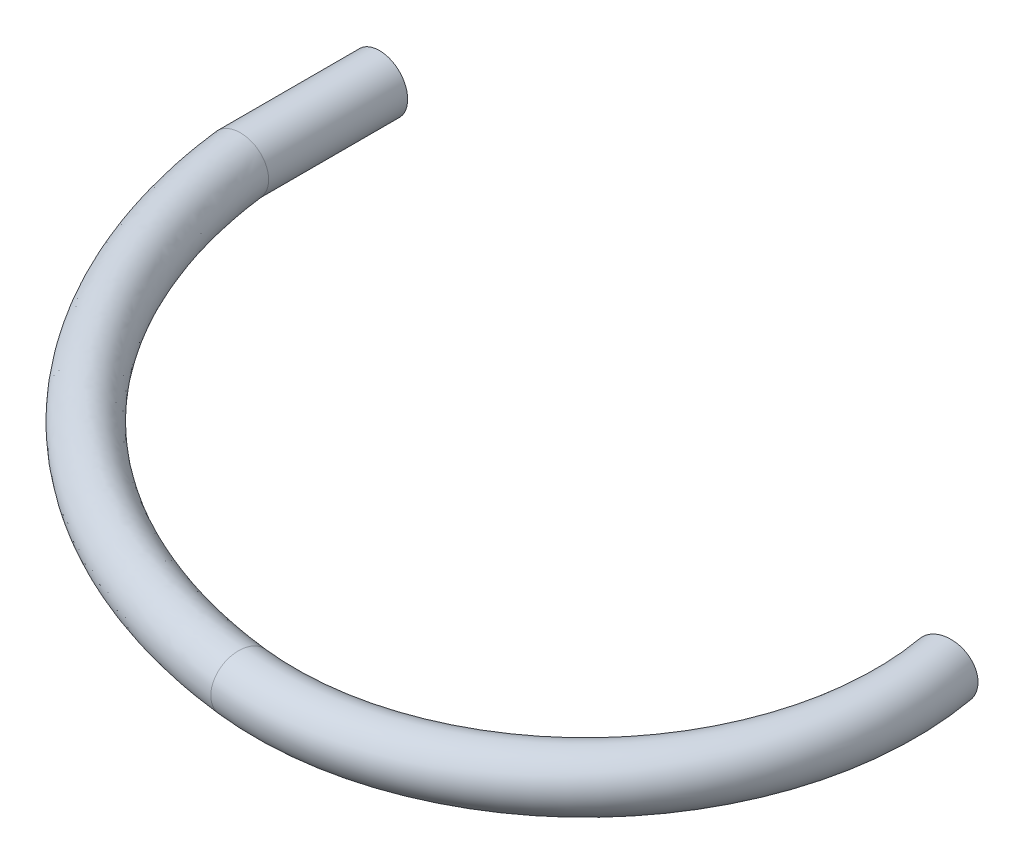
ISO-10303-21;
HEADER;
FILE_DESCRIPTION(('STEP AP214'),'2;1');
FILE_NAME('part.step','',(''),(''),'','','');
FILE_SCHEMA(('AUTOMOTIVE_DESIGN { 1 0 10303 214 1 1 1 1 }'));
ENDSEC;
DATA;
#1=APPLICATION_CONTEXT('core data for automotive mechanical design processes');
#2=APPLICATION_PROTOCOL_DEFINITION('international standard','automotive_design',2000,#1);
#3=PRODUCT_CONTEXT('',#1,'mechanical');
#4=PRODUCT('Part','Part','',(#3));
#5=PRODUCT_RELATED_PRODUCT_CATEGORY('part','',(#4));
#6=PRODUCT_DEFINITION_FORMATION('','',#4);
#7=PRODUCT_DEFINITION_CONTEXT('part definition',#1,'design');
#8=PRODUCT_DEFINITION('design','',#6,#7);
#9=PRODUCT_DEFINITION_SHAPE('','',#8);
#10=(LENGTH_UNIT() NAMED_UNIT(*) SI_UNIT(.MILLI.,.METRE.));
#11=(NAMED_UNIT(*) PLANE_ANGLE_UNIT() SI_UNIT($,.RADIAN.));
#12=(NAMED_UNIT(*) SI_UNIT($,.STERADIAN.) SOLID_ANGLE_UNIT());
#13=UNCERTAINTY_MEASURE_WITH_UNIT(LENGTH_MEASURE(1.E-05),#10,'distance_accuracy_value','');
#14=(GEOMETRIC_REPRESENTATION_CONTEXT(3) GLOBAL_UNCERTAINTY_ASSIGNED_CONTEXT((#13)) GLOBAL_UNIT_ASSIGNED_CONTEXT((#10,
#11,#12)) REPRESENTATION_CONTEXT('',''));
#15=CARTESIAN_POINT('',(0.,0.,0.));
#16=DIRECTION('',(0.,0.,1.));
#17=DIRECTION('',(1.,0.,0.));
#18=AXIS2_PLACEMENT_3D('',#15,#16,#17);
#19=CARTESIAN_POINT('',(112.254038487492,0.,31.8995068464256));
#20=DIRECTION('',(-0.17683972373716,0.,-0.984239661926182));
#21=DIRECTION('',(-0.984239661926182,0.,0.17683972373716));
#22=AXIS2_PLACEMENT_3D('',#19,#20,#21);
#23=PLANE('',#22);
#24=CARTESIAN_POINT('',(112.254038487492,0.,31.8995068464256));
#25=DIRECTION('',(-0.17683972373716,0.,-0.984239661926182));
#26=DIRECTION('',(-0.984239661926182,0.,0.17683972373716));
#27=AXIS2_PLACEMENT_3D('',#24,#25,#26);
#28=CIRCLE('',#27,4.);
#29=CARTESIAN_POINT('',(116.190997135197,0.,31.1921479514769));
#30=VERTEX_POINT('',#29);
#31=EDGE_CURVE('E46',#30,#30,#28,.T.);
#32=ORIENTED_EDGE('',*,*,#31,.T.);
#33=EDGE_LOOP('',(#32));
#34=FACE_BOUND('',#33,.T.);
#35=ADVANCED_FACE('F43',(#34),#23,.T.);
#36=CARTESIAN_POINT('',(0.,0.,0.));
#37=DIRECTION('',(0.,0.,1.));
#38=DIRECTION('',(1.,0.,0.));
#39=AXIS2_PLACEMENT_3D('',#36,#37,#38);
#40=PLANE('',#39);
#41=CARTESIAN_POINT('',(0.,0.,0.));
#42=DIRECTION('',(0.,0.,1.));
#43=DIRECTION('',(1.,0.,0.));
#44=AXIS2_PLACEMENT_3D('',#41,#42,#43);
#45=CIRCLE('',#44,4.);
#46=CARTESIAN_POINT('',(4.,0.,0.));
#47=VERTEX_POINT('',#46);
#48=EDGE_CURVE('E63',#47,#47,#45,.T.);
#49=ORIENTED_EDGE('',*,*,#48,.F.);
#50=EDGE_LOOP('',(#49));
#51=FACE_BOUND('',#50,.T.);
#52=ADVANCED_FACE('F91',(#51),#40,.F.);
#53=CARTESIAN_POINT('',(68.969627827404,0.,39.6764777604771));
#54=DIRECTION('',(0.,1.,0.));
#55=DIRECTION('',(0.,0.,1.));
#56=AXIS2_PLACEMENT_3D('',#53,#54,#55);
#57=TOROIDAL_SURFACE('',#56,43.9775111027121,4.);
#58=CARTESIAN_POINT('',(63.8332428595129,0.,83.3530050062505));
#59=DIRECTION('',(0.993155959730515,0.,0.116795717608821));
#60=DIRECTION('',(0.116795717608821,0.,-0.993155959730515));
#61=AXIS2_PLACEMENT_3D('',#58,#59,#60);
#62=CIRCLE('',#61,4.);
#63=CARTESIAN_POINT('',(63.3660599890776,0.,87.3256288451725));
#64=VERTEX_POINT('',#63);
#65=EDGE_CURVE('E139',#64,#64,#62,.T.);
#66=CARTESIAN_POINT('',(68.969627827404,0.,39.6764777604771));
#67=DIRECTION('',(0.,1.,0.));
#68=DIRECTION('',(0.,0.,1.));
#69=AXIS2_PLACEMENT_3D('',#66,#67,#68);
#70=CIRCLE('',#69,47.9775111027121);
#71=EDGE_CURVE('',#64,#30,#70,.T.);
#72=ORIENTED_EDGE('',*,*,#65,.T.);
#73=ORIENTED_EDGE('',*,*,#31,.F.);
#74=ORIENTED_EDGE('',*,*,#71,.T.);
#75=ORIENTED_EDGE('',*,*,#71,.F.);
#76=EDGE_LOOP('',(#72,#74,#73,#75));
#77=FACE_BOUND('',#76,.T.);
#78=ADVANCED_FACE('F82',(#77),#57,.T.);
#79=CARTESIAN_POINT('',(3.92243417999132,0.,19.131227352295));
#80=CARTESIAN_POINT('',(3.93795031240802,0.,19.2550951386539));
#81=CARTESIAN_POINT('',(3.95389163987146,0.,19.3823605803521));
#82=CARTESIAN_POINT('',(4.03000584490323,0.,19.9899761331784));
#83=CARTESIAN_POINT('',(4.09249880961834,0.,20.4490169712662));
#84=CARTESIAN_POINT('',(4.23073210210726,0.,21.3931264613839));
#85=CARTESIAN_POINT('',(4.30474982846883,0.,21.8644564047419));
#86=CARTESIAN_POINT('',(4.54145878444363,0.,23.2759762977133));
#87=CARTESIAN_POINT('',(4.71880793578901,0.,24.2136967502557));
#88=CARTESIAN_POINT('',(5.30903013894282,0.,27.0145924952574));
#89=CARTESIAN_POINT('',(5.78011295662286,0.,28.8654977322318));
#90=CARTESIAN_POINT('',(7.42127892883128,0.,34.3499680743171));
#91=CARTESIAN_POINT('',(8.81969509014636,0.,37.914884529046));
#92=CARTESIAN_POINT('',(13.870788547002,0.,48.1899672913297));
#93=CARTESIAN_POINT('',(18.385926823418,0.,54.4740887549169));
#94=CARTESIAN_POINT('',(29.2212935906813,0.,65.2279376008308));
#95=CARTESIAN_POINT('',(35.539332458638,0.,69.6954918395956));
#96=CARTESIAN_POINT('',(49.2899107638137,0.,76.3266330867662));
#97=CARTESIAN_POINT('',(56.7196713982393,0.,78.4888800556315));
#98=CARTESIAN_POINT('',(64.3004257299481,0.,79.3803811673284));
#99=CARTESIAN_POINT('',(3.92243417999132,8.,19.131227352295));
#100=CARTESIAN_POINT('',(3.93795031240802,8.,19.2550951386539));
#101=CARTESIAN_POINT('',(3.95389163987146,8.,19.3823605803521));
#102=CARTESIAN_POINT('',(4.03000584490323,8.,19.9899761331784));
#103=CARTESIAN_POINT('',(4.09249880961834,8.,20.4490169712662));
#104=CARTESIAN_POINT('',(4.23073210210726,8.,21.3931264613839));
#105=CARTESIAN_POINT('',(4.30474982846883,8.,21.8644564047419));
#106=CARTESIAN_POINT('',(4.54145878444363,8.,23.2759762977133));
#107=CARTESIAN_POINT('',(4.71880793578901,8.,24.2136967502557));
#108=CARTESIAN_POINT('',(5.30903013894282,8.,27.0145924952574));
#109=CARTESIAN_POINT('',(5.78011295662286,8.,28.8654977322318));
#110=CARTESIAN_POINT('',(7.42127892883128,8.,34.3499680743171));
#111=CARTESIAN_POINT('',(8.81969509014636,8.,37.914884529046));
#112=CARTESIAN_POINT('',(13.870788547002,8.,48.1899672913297));
#113=CARTESIAN_POINT('',(18.385926823418,8.,54.4740887549169));
#114=CARTESIAN_POINT('',(29.2212935906813,8.,65.2279376008308));
#115=CARTESIAN_POINT('',(35.539332458638,8.,69.6954918395956));
#116=CARTESIAN_POINT('',(49.2899107638137,8.,76.3266330867662));
#117=CARTESIAN_POINT('',(56.7196713982393,8.,78.4888800556315));
#118=CARTESIAN_POINT('',(64.3004257299481,8.,79.3803811673284));
#119=CARTESIAN_POINT('',(-4.01553097449153,8.,20.1255659295492));
#120=CARTESIAN_POINT('',(-4.00001484207484,8.,20.2494337159081));
#121=CARTESIAN_POINT('',(-3.98492475385736,8.,20.3699039553106));
#122=CARTESIAN_POINT('',(-3.90451715094644,8.,21.011792489867));
#123=CARTESIAN_POINT('',(-3.83112791423149,8.,21.5531939543116));
#124=CARTESIAN_POINT('',(-3.67684775537159,8.,22.6069007675798));
#125=CARTESIAN_POINT('',(-3.59423765200311,8.,23.132945233621));
#126=CARTESIAN_POINT('',(-3.3300502433574,8.,24.7083219710215));
#127=CARTESIAN_POINT('',(-3.13211344571064,8.,25.7548980727607));
#128=CARTESIAN_POINT('',(-2.47337506492864,8.,28.8809369068796));
#129=CARTESIAN_POINT('',(-1.94760641224395,8.,30.9467052095151));
#130=CARTESIAN_POINT('',(-0.115925039772885,8.,37.0678424580481));
#131=CARTESIAN_POINT('',(1.44482681409656,8.,41.0465936478206));
#132=CARTESIAN_POINT('',(7.08227845045061,8.,52.5144634518985));
#133=CARTESIAN_POINT('',(12.1215583374653,8.,59.5280796382962));
#134=CARTESIAN_POINT('',(24.2147529366709,8.,71.530293276037));
#135=CARTESIAN_POINT('',(31.2662238426417,8.,76.5164653136402));
#136=CARTESIAN_POINT('',(46.6130434629126,8.,83.917385212196));
#137=CARTESIAN_POINT('',(54.9052907958328,8.,86.3306374747177));
#138=CARTESIAN_POINT('',(63.3660599890775,8.,87.3256288451725));
#139=CARTESIAN_POINT('',(-4.01553097449154,0.,20.1255659295492));
#140=CARTESIAN_POINT('',(-4.00001484207484,0.,20.2494337159081));
#141=CARTESIAN_POINT('',(-3.98492475385739,0.,20.3699039553106));
#142=CARTESIAN_POINT('',(-3.90451715094633,0.,21.011792489867));
#143=CARTESIAN_POINT('',(-3.83112791423149,0.,21.5531939543116));
#144=CARTESIAN_POINT('',(-3.6768477553716,0.,22.6069007675798));
#145=CARTESIAN_POINT('',(-3.59423765200311,0.,23.132945233621));
#146=CARTESIAN_POINT('',(-3.3300502433574,0.,24.7083219710215));
#147=CARTESIAN_POINT('',(-3.13211344571064,0.,25.7548980727616));
#148=CARTESIAN_POINT('',(-2.47337506492864,0.,28.8809369068779));
#149=CARTESIAN_POINT('',(-1.94760641224395,0.,30.9467052095186));
#150=CARTESIAN_POINT('',(-0.115925039772886,0.,37.0678424580411));
#151=CARTESIAN_POINT('',(1.44482681409655,0.,41.0465936478206));
#152=CARTESIAN_POINT('',(7.08227845045061,0.,52.5144634518985));
#153=CARTESIAN_POINT('',(12.1215583374653,0.,59.5280796382962));
#154=CARTESIAN_POINT('',(24.2147529366709,0.,71.530293276037));
#155=CARTESIAN_POINT('',(31.2662238426417,0.,76.5164653136402));
#156=CARTESIAN_POINT('',(46.6130434629126,0.,83.917385212196));
#157=CARTESIAN_POINT('',(54.9052907958328,0.,86.3306374747177));
#158=CARTESIAN_POINT('',(63.3660599890775,0.,87.3256288451725));
#159=CARTESIAN_POINT('',(-4.01553097449154,-8.,20.1255659295492));
#160=CARTESIAN_POINT('',(-4.00001484207484,-8.,20.2494337159081));
#161=CARTESIAN_POINT('',(-3.98492475385742,-8.,20.3699039553106));
#162=CARTESIAN_POINT('',(-3.90451715094623,-8.,21.011792489867));
#163=CARTESIAN_POINT('',(-3.83112791423149,-8.,21.5531939543116));
#164=CARTESIAN_POINT('',(-3.6768477553716,-8.,22.6069007675798));
#165=CARTESIAN_POINT('',(-3.59423765200311,-8.,23.132945233621));
#166=CARTESIAN_POINT('',(-3.33005024335741,-8.,24.7083219710215));
#167=CARTESIAN_POINT('',(-3.13211344571064,-8.,25.7548980727625));
#168=CARTESIAN_POINT('',(-2.47337506492864,-8.,28.8809369068761));
#169=CARTESIAN_POINT('',(-1.94760641224395,-8.,30.9467052095221));
#170=CARTESIAN_POINT('',(-0.115925039772887,-8.,37.0678424580341));
#171=CARTESIAN_POINT('',(1.44482681409655,-8.,41.0465936478206));
#172=CARTESIAN_POINT('',(7.08227845045061,-8.,52.5144634518985));
#173=CARTESIAN_POINT('',(12.1215583374653,-8.,59.5280796382962));
#174=CARTESIAN_POINT('',(24.2147529366709,-8.,71.530293276037));
#175=CARTESIAN_POINT('',(31.2662238426417,-8.,76.5164653136402));
#176=CARTESIAN_POINT('',(46.6130434629126,-8.,83.917385212196));
#177=CARTESIAN_POINT('',(54.9052907958328,-8.,86.3306374747177));
#178=CARTESIAN_POINT('',(63.3660599890775,-8.,87.3256288451725));
#179=CARTESIAN_POINT('',(3.92243417999132,-8.,19.131227352295));
#180=CARTESIAN_POINT('',(3.93795031240802,-8.,19.2550951386539));
#181=CARTESIAN_POINT('',(3.95389163987146,-8.,19.3823605803521));
#182=CARTESIAN_POINT('',(4.03000584490323,-8.,19.9899761331784));
#183=CARTESIAN_POINT('',(4.09249880961834,-8.,20.4490169712662));
#184=CARTESIAN_POINT('',(4.23073210210726,-8.,21.3931264613839));
#185=CARTESIAN_POINT('',(4.30474982846883,-8.,21.8644564047419));
#186=CARTESIAN_POINT('',(4.54145878444363,-8.,23.2759762977133));
#187=CARTESIAN_POINT('',(4.71880793578901,-8.,24.2136967502557));
#188=CARTESIAN_POINT('',(5.30903013894282,-8.,27.0145924952574));
#189=CARTESIAN_POINT('',(5.78011295662286,-8.,28.8654977322318));
#190=CARTESIAN_POINT('',(7.42127892883128,-8.,34.3499680743171));
#191=CARTESIAN_POINT('',(8.81969509014636,-8.,37.914884529046));
#192=CARTESIAN_POINT('',(13.870788547002,-8.,48.1899672913297));
#193=CARTESIAN_POINT('',(18.385926823418,-8.,54.4740887549169));
#194=CARTESIAN_POINT('',(29.2212935906813,-8.,65.2279376008308));
#195=CARTESIAN_POINT('',(35.539332458638,-8.,69.6954918395956));
#196=CARTESIAN_POINT('',(49.2899107638137,-8.,76.3266330867662));
#197=CARTESIAN_POINT('',(56.7196713982393,-8.,78.4888800556315));
#198=CARTESIAN_POINT('',(64.3004257299481,-8.,79.3803811673284));
#199=CARTESIAN_POINT('',(3.92243417999132,0.,19.131227352295));
#200=CARTESIAN_POINT('',(3.93795031240802,0.,19.2550951386539));
#201=CARTESIAN_POINT('',(3.95389163987146,0.,19.3823605803521));
#202=CARTESIAN_POINT('',(4.03000584490323,0.,19.9899761331784));
#203=CARTESIAN_POINT('',(4.09249880961834,0.,20.4490169712662));
#204=CARTESIAN_POINT('',(4.23073210210726,0.,21.3931264613839));
#205=CARTESIAN_POINT('',(4.30474982846883,0.,21.8644564047419));
#206=CARTESIAN_POINT('',(4.54145878444363,0.,23.2759762977133));
#207=CARTESIAN_POINT('',(4.71880793578901,0.,24.2136967502557));
#208=CARTESIAN_POINT('',(5.30903013894282,0.,27.0145924952574));
#209=CARTESIAN_POINT('',(5.78011295662286,0.,28.8654977322318));
#210=CARTESIAN_POINT('',(7.42127892883128,0.,34.3499680743171));
#211=CARTESIAN_POINT('',(8.81969509014636,0.,37.914884529046));
#212=CARTESIAN_POINT('',(13.870788547002,0.,48.1899672913297));
#213=CARTESIAN_POINT('',(18.385926823418,0.,54.4740887549169));
#214=CARTESIAN_POINT('',(29.2212935906813,0.,65.2279376008308));
#215=CARTESIAN_POINT('',(35.539332458638,0.,69.6954918395956));
#216=CARTESIAN_POINT('',(49.2899107638137,0.,76.3266330867662));
#217=CARTESIAN_POINT('',(56.7196713982393,0.,78.4888800556315));
#218=CARTESIAN_POINT('',(64.3004257299481,0.,79.3803811673284));
#219=(BOUNDED_SURFACE() B_SPLINE_SURFACE(3,3,((#79,#80,#81,#82,#83,#84,#85,#86,#87,#88,#89,#90,
#91,#92,#93,#94,#95,#96,#97,#98),(#99,#100,#101,#102,#103,#104,#105,#106,#107,#108,#109,#110,
#111,#112,#113,#114,#115,#116,#117,#118),(#119,#120,#121,#122,#123,#124,#125,#126,#127,#128,
#129,#130,#131,#132,#133,#134,#135,#136,#137,#138),(#139,#140,#141,#142,#143,#144,#145,#146,
#147,#148,#149,#150,#151,#152,#153,#154,#155,#156,#157,#158),(#159,#160,#161,#162,#163,#164,
#165,#166,#167,#168,#169,#170,#171,#172,#173,#174,#175,#176,#177,#178),(#179,#180,#181,#182,
#183,#184,#185,#186,#187,#188,#189,#190,#191,#192,#193,#194,#195,#196,#197,#198),(#199,#200,
#201,#202,#203,#204,#205,#206,#207,#208,#209,#210,#211,#212,#213,#214,#215,#216,#217,#218)),
.UNSPECIFIED.,.T.,.F.,.F.) B_SPLINE_SURFACE_WITH_KNOTS((4,3,4),(4,2,2,2,2,2,2,2,2,4),(0.,0.5,
1.),(-0.0020925133234745,0.,0.00846150225753349,0.016923004515067,0.033846009030134,
0.0676920180602679,0.135384036120536,0.270768072241072,0.406152108361608,0.541536144482143),
.UNSPECIFIED.) GEOMETRIC_REPRESENTATION_ITEM() RATIONAL_B_SPLINE_SURFACE(((1.,1.,1.,1.,1.,1.,1.,
1.,1.,1.,1.,1.,1.,1.,1.,1.,1.,1.,1.,1.),(0.333333333333333,0.333333333333333,0.333333333333333,
0.333333333333333,0.333333333333333,0.333333333333333,0.333333333333333,0.333333333333333,
0.333333333333333,0.333333333333333,0.333333333333333,0.333333333333333,0.333333333333333,
0.333333333333333,0.333333333333333,0.333333333333333,0.333333333333333,0.333333333333333,
0.333333333333333,0.333333333333333),(0.333333333333333,0.333333333333333,0.333333333333333,
0.333333333333333,0.333333333333333,0.333333333333333,0.333333333333333,0.333333333333333,
0.333333333333333,0.333333333333333,0.333333333333333,0.333333333333333,0.333333333333333,
0.333333333333333,0.333333333333333,0.333333333333333,0.333333333333333,0.333333333333333,
0.333333333333333,0.333333333333333),(1.,1.,1.,1.,1.,1.,1.,1.,1.,1.,1.,1.,1.,1.,1.,1.,1.,1.,1.,
1.),(0.333333333333333,0.333333333333333,0.333333333333333,0.333333333333333,0.333333333333333,
0.333333333333333,0.333333333333333,0.333333333333333,0.333333333333333,0.333333333333333,
0.333333333333333,0.333333333333333,0.333333333333333,0.333333333333333,0.333333333333333,
0.333333333333333,0.333333333333333,0.333333333333333,0.333333333333333,0.333333333333333),
(0.333333333333333,0.333333333333333,0.333333333333333,0.333333333333333,0.333333333333333,
0.333333333333333,0.333333333333333,0.333333333333333,0.333333333333333,0.333333333333333,
0.333333333333333,0.333333333333333,0.333333333333333,0.333333333333333,0.333333333333333,
0.333333333333333,0.333333333333333,0.333333333333333,0.333333333333333,0.333333333333333),(1.,
1.,1.,1.,1.,1.,1.,1.,1.,1.,1.,1.,1.,1.,1.,1.,1.,1.,1.,1.))) REPRESENTATION_ITEM('') SURFACE());
#220=CARTESIAN_POINT('',(0.,-4.,20.));
#221=CARTESIAN_POINT('',(-0.011935794807484,-4.00000007340912,20.0007446715165));
#222=CARTESIAN_POINT('',(-0.0238722044714065,-3.99994663671084,20.0014893811523));
#223=CARTESIAN_POINT('',(-0.148208547472157,-3.99883287685429,20.0092466922408));
#224=CARTESIAN_POINT('',(-0.260614138843314,-3.99308341390221,20.0162596257737));
#225=CARTESIAN_POINT('',(-0.48457385095584,-3.97213440302133,20.0302323320152));
#226=CARTESIAN_POINT('',(-0.596127516960446,-3.95693012266944,20.0371920763339));
#227=CARTESIAN_POINT('',(-0.817814075365346,-3.91712659504178,20.0510228903669));
#228=CARTESIAN_POINT('',(-0.927943409262226,-3.89250727690025,20.0578937379967));
#229=CARTESIAN_POINT('',(-1.1457943533043,-3.83404510603826,20.0714851887242));
#230=CARTESIAN_POINT('',(-1.25351407221183,-3.80019526565363,20.0782056738074));
#231=CARTESIAN_POINT('',(-1.57140031977759,-3.68528278818464,20.0980381220964));
#232=CARTESIAN_POINT('',(-1.77688542058312,-3.59075034864622,20.1108579802436));
#233=CARTESIAN_POINT('',(-2.16905875453527,-3.36838210927783,20.1353249277009));
#234=CARTESIAN_POINT('',(-2.35574618672501,-3.24054489118396,20.146971967038));
#235=CARTESIAN_POINT('',(-2.61751636178703,-3.02677165898112,20.163303233754));
#236=CARTESIAN_POINT('',(-2.70174450264648,-2.95182727718698,20.1685580375617));
#237=CARTESIAN_POINT('',(-2.86353235380145,-2.79514527803056,20.178651609714));
#238=CARTESIAN_POINT('',(-2.94109842587468,-2.71341429145213,20.1834907749624));
#239=CARTESIAN_POINT('',(-3.08910568648603,-2.54364176353361,20.1927245958261));
#240=CARTESIAN_POINT('',(-3.15954334367003,-2.45559713101159,20.1971190311262));
#241=CARTESIAN_POINT('',(-3.29275356322931,-2.27387055935346,20.2054296918004));
#242=CARTESIAN_POINT('',(-3.35552435541969,-2.18018732575908,20.2093458067362));
#243=CARTESIAN_POINT('',(-3.53136506720669,-1.89206178006912,20.2203160724024));
#244=CARTESIAN_POINT('',(-3.63239905370219,-1.69004280242001,20.2266193282325));
#245=CARTESIAN_POINT('',(-3.79905361000752,-1.27196855854819,20.237016484536));
#246=CARTESIAN_POINT('',(-3.86467527760204,-1.0559137276707,20.2411104534975));
#247=CARTESIAN_POINT('',(-3.95863268938738,-0.616166625222815,20.246972217339));
#248=CARTESIAN_POINT('',(-3.98703155194403,-0.392487944068903,20.2487439500136));
#249=CARTESIAN_POINT('',(-4.00590824941168,0.0564621537020973,20.2499216190723));
#250=CARTESIAN_POINT('',(-3.99638627970877,0.28173356210673,20.2493275676462));
#251=CARTESIAN_POINT('',(-3.9397258661103,0.72728777000522,20.2457926687562));
#252=CARTESIAN_POINT('',(-3.89261844969474,0.947574530231184,20.2428537570179));
#253=CARTESIAN_POINT('',(-3.76217529658861,1.37710452329498,20.2347157399238));
#254=CARTESIAN_POINT('',(-3.67883910129018,1.58634761629717,20.2295166059567));
#255=CARTESIAN_POINT('',(-3.47827800855562,1.98795996515654,20.2170041029558));
#256=CARTESIAN_POINT('',(-3.36103734164529,2.18032131467129,20.2096897501023));
#257=CARTESIAN_POINT('',(-3.09604309481574,2.54261339134975,20.1931574055646));
#258=CARTESIAN_POINT('',(-2.94829194665219,2.71254590437518,20.1839395655927));
#259=CARTESIAN_POINT('',(-2.62595201246614,3.02572951870875,20.1638295185989));
#260=CARTESIAN_POINT('',(-2.45127749749291,3.16889203830489,20.1529319630518));
#261=CARTESIAN_POINT('',(-2.08032854291846,3.42387268512218,20.1297892245155));
#262=CARTESIAN_POINT('',(-1.88404356276666,3.53567542138215,20.1175433838973));
#263=CARTESIAN_POINT('',(-1.47541046516779,3.72477006775669,20.0920494677522));
#264=CARTESIAN_POINT('',(-1.2630505220445,3.80203627653264,20.0788006543798));
#265=CARTESIAN_POINT('',(-0.828754841291305,3.91964429128779,20.0517054875185));
#266=CARTESIAN_POINT('',(-0.606840007812046,3.96006280278228,20.03786043846));
#267=CARTESIAN_POINT('',(-0.267768991750449,3.99272001395884,20.0167060137946));
#268=CARTESIAN_POINT('',(-0.151798689122014,3.99880153604706,20.0094706801913));
#269=CARTESIAN_POINT('',(-0.0238725112710816,3.99994654974581,20.0014894002873));
#270=CARTESIAN_POINT('',(-0.0119361351665935,3.99999997727514,20.0007446927478));
#271=CARTESIAN_POINT('',(0.,4.,20.));
#272=B_SPLINE_CURVE_WITH_KNOTS('',3,(#220,#221,#222,#223,#224,#225,#226,#227,#228,#229,#230,
#231,#232,#233,#234,#235,#236,#237,#238,#239,#240,#241,#242,#243,#244,#245,#246,#247,#248,#249,
#250,#251,#252,#253,#254,#255,#256,#257,#258,#259,#260,#261,#262,#263,#264,#265,#266,#267,#268,
#269,#270,#271),.UNSPECIFIED.,.F.,.F.,(4,2,2,2,2,2,2,2,2,2,2,2,2,2,2,2,2,2,2,2,2,2,2,2,2,4),(0.,
0.0358786613244195,0.373730254477473,0.711751088872021,1.0504965655451,1.38949919370092,
2.06572093122155,2.74197146994502,3.08023110853611,3.4181640573768,3.7562636040727,
4.09444106682156,4.76882804102534,5.44319410797842,6.11641517288285,6.78963276903801,
7.46229518594183,8.13496611809953,8.80795042410958,9.48088111240795,10.1560005742656,
10.8314507982484,11.5074028442364,12.1819445324224,12.5305963367816,12.566474998106),.UNSPECIFIED.);
#273=CARTESIAN_POINT('',(0.,-4.,20.));
#274=VERTEX_POINT('',#273);
#275=CARTESIAN_POINT('',(0.,4.,20.));
#276=VERTEX_POINT('',#275);
#277=EDGE_CURVE('E11',#274,#276,#272,.T.);
#278=CARTESIAN_POINT('',(0.,-4.,20.));
#279=CARTESIAN_POINT('',(0.0119357948326876,-4.00000007341098,19.9992553288046));
#280=CARTESIAN_POINT('',(0.0238721987721,-3.99994663671327,19.9985105275256));
#281=CARTESIAN_POINT('',(0.148216055783911,-3.9988328100548,19.9907508298546));
#282=CARTESIAN_POINT('',(0.260628666552058,-3.99308264931892,19.9837275571578));
#283=CARTESIAN_POINT('',(0.484601291572561,-3.97213124113606,19.9697182737475));
#284=CARTESIAN_POINT('',(0.59616085041517,-3.95692525971506,19.9627322834672));
#285=CARTESIAN_POINT('',(0.817858107154804,-3.91711756515613,19.9488337931259));
#286=CARTESIAN_POINT('',(0.92799224330833,-3.89249577518999,19.941921482766));
#287=CARTESIAN_POINT('',(1.14585169327217,-3.83402811080721,19.9282331478061));
#288=CARTESIAN_POINT('',(1.25357511517122,-3.80017524889218,19.9214572306386));
#289=CARTESIAN_POINT('',(1.57147042141672,-3.68525336696165,19.9014400809406));
#290=CARTESIAN_POINT('',(1.7769594407752,-3.59071408567066,19.8884723184849));
#291=CARTESIAN_POINT('',(2.16913810216661,-3.3683314079062,19.8636762500135));
#292=CARTESIAN_POINT('',(2.35582694164159,-3.24048659049282,19.8518479926429));
#293=CARTESIAN_POINT('',(2.61760134709853,-3.02669841900545,19.8352351788761));
#294=CARTESIAN_POINT('',(2.70183262548587,-2.95174689306765,19.8298847985958));
#295=CARTESIAN_POINT('',(2.86362591995022,-2.79504971185579,19.8195996421459));
#296=CARTESIAN_POINT('',(2.94119429846381,-2.71331068808457,19.8146644695871));
#297=CARTESIAN_POINT('',(3.08920527765622,-2.5435211481378,19.8052407991934));
#298=CARTESIAN_POINT('',(3.15964434699799,-2.45546754071672,19.8007525227358));
#299=CARTESIAN_POINT('',(3.29285637275609,-2.27372208019754,19.7922590529458));
#300=CARTESIAN_POINT('',(3.35562755906669,-2.18002893265346,19.7882539711599));
#301=CARTESIAN_POINT('',(3.53146276024445,-1.89188037987136,19.7770287157932));
#302=CARTESIAN_POINT('',(3.63249046011159,-1.68984775085784,19.7705703644152));
#303=CARTESIAN_POINT('',(3.79912918220275,-1.27174463962107,19.759910549748));
#304=CARTESIAN_POINT('',(3.86474132467403,-1.05567460166437,19.7557090150723));
#305=CARTESIAN_POINT('',(3.95867067173519,-0.615918952728703,19.749692404277));
#306=CARTESIAN_POINT('',(3.98705469140399,-0.392247726470265,19.7478730527502));
#307=CARTESIAN_POINT('',(4.00590458019396,0.0566853888165659,19.7466649363309));
#308=CARTESIAN_POINT('',(3.99637066790955,0.28194726866747,19.7472761574262));
#309=CARTESIAN_POINT('',(3.93969167408846,0.727465703983133,19.7509080953214));
#310=CARTESIAN_POINT('',(3.89257999237496,0.947726525762153,19.7539266724181));
#311=CARTESIAN_POINT('',(3.76213731767693,1.37720420508539,19.7622773478346));
#312=CARTESIAN_POINT('',(3.67880581204077,1.58642090626526,19.7676094789004));
#313=CARTESIAN_POINT('',(3.47826007806892,1.9879892349293,19.7804264277336));
#314=CARTESIAN_POINT('',(3.3610288187619,2.18033232177782,19.787912327528));
#315=CARTESIAN_POINT('',(3.09606118360231,2.5425893059574,19.8048066377658));
#316=CARTESIAN_POINT('',(2.94832744626513,2.71250514120065,19.8142148819223));
#317=CARTESIAN_POINT('',(2.62632987643141,3.02536866702525,19.834684786483));
#318=CARTESIAN_POINT('',(2.45202949552226,3.16827858874766,19.8457487242802));
#319=CARTESIAN_POINT('',(2.08190253662462,3.42288673555518,19.8691965651382));
#320=CARTESIAN_POINT('',(1.88606533668907,3.53456946234408,19.8815811194341));
#321=CARTESIAN_POINT('',(1.47764891830875,3.72390334738372,19.907353732939));
#322=CARTESIAN_POINT('',(1.26500215307307,3.80140801538263,19.9207458292087));
#323=CARTESIAN_POINT('',(0.830083509310262,3.91938317045123,19.9480741124252));
#324=CARTESIAN_POINT('',(0.607832604781185,3.95993047124639,19.9620091077968));
#325=CARTESIAN_POINT('',(0.268202096413246,3.99269725357486,19.9832544034915));
#326=CARTESIAN_POINT('',(0.152015495765944,3.9987995948429,19.9905137277911));
#327=CARTESIAN_POINT('',(0.0238725045751662,3.99994654987343,19.998510508171));
#328=CARTESIAN_POINT('',(0.0119361341459899,3.99999997741939,19.9992553073329));
#329=CARTESIAN_POINT('',(0.,4.,20.));
#330=B_SPLINE_CURVE_WITH_KNOTS('',3,(#278,#279,#280,#281,#282,#283,#284,#285,#286,#287,#288,
#289,#290,#291,#292,#293,#294,#295,#296,#297,#298,#299,#300,#301,#302,#303,#304,#305,#306,#307,
#308,#309,#310,#311,#312,#313,#314,#315,#316,#317,#318,#319,#320,#321,#322,#323,#324,#325,#326,
#327,#328,#329),.UNSPECIFIED.,.F.,.F.,(4,2,2,2,2,2,2,2,2,2,2,2,2,2,2,2,2,2,2,2,2,2,2,2,2,4),(0.,
0.0358786613247844,0.373753198296037,0.711797025537319,1.05056570124996,1.38959152460294,
2.06585776361513,2.74215285942433,3.08044717013425,3.41841476496445,3.75654895321427,
4.09476105171445,4.7691886375183,5.44359488891485,6.116789087587,6.7899794053442,
7.46257204483247,8.13517420443729,8.80811486293384,9.48099733530657,10.154814006999,
10.8289645078563,11.505977041968,12.1815792149289,12.5308830707346,12.5667617320594),.UNSPECIFIED.);
#331=EDGE_CURVE('E51',#274,#276,#330,.T.);
#332=ORIENTED_EDGE('',*,*,#277,.F.);
#333=ORIENTED_EDGE('',*,*,#331,.T.);
#334=EDGE_LOOP('',(#332,#333));
#335=FACE_BOUND('',#334,.T.);
#336=ORIENTED_EDGE('',*,*,#65,.F.);
#337=EDGE_LOOP('',(#336));
#338=FACE_BOUND('',#337,.T.);
#339=ADVANCED_FACE('F58',(#335,#338),#219,.T.);
#340=CARTESIAN_POINT('',(0.,0.,0.));
#341=DIRECTION('',(0.,0.,1.));
#342=DIRECTION('',(1.,0.,0.));
#343=AXIS2_PLACEMENT_3D('',#340,#341,#342);
#344=CYLINDRICAL_SURFACE('',#343,4.);
#345=ORIENTED_EDGE('',*,*,#331,.F.);
#346=ORIENTED_EDGE('',*,*,#277,.T.);
#347=EDGE_LOOP('',(#345,#346));
#348=FACE_BOUND('',#347,.T.);
#349=ORIENTED_EDGE('',*,*,#48,.T.);
#350=EDGE_LOOP('',(#349));
#351=FACE_BOUND('',#350,.T.);
#352=ADVANCED_FACE('F61',(#348,#351),#344,.T.);
#353=CLOSED_SHELL('',(#35,#52,#78,#339,#352));
#354=MANIFOLD_SOLID_BREP('B2',#353);
#355=ADVANCED_BREP_SHAPE_REPRESENTATION('',(#18,#354),#14);
#356=SHAPE_DEFINITION_REPRESENTATION(#9,#355);
ENDSEC;
END-ISO-10303-21;
